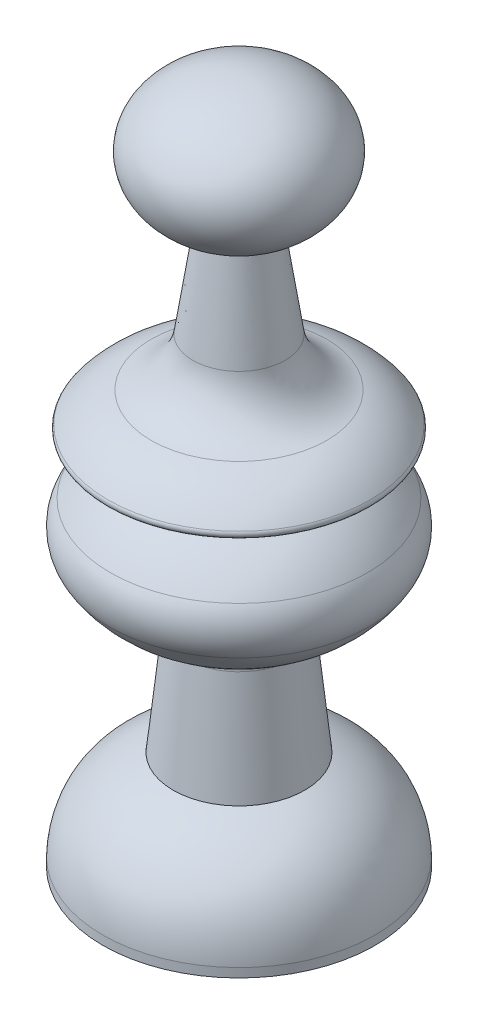
ISO-10303-21;
HEADER;
FILE_DESCRIPTION(('STEP AP214'),'2;1');
FILE_NAME('part.step','',(''),(''),'','','');
FILE_SCHEMA(('AUTOMOTIVE_DESIGN { 1 0 10303 214 1 1 1 1 }'));
ENDSEC;
DATA;
#1=APPLICATION_CONTEXT('core data for automotive mechanical design processes');
#2=APPLICATION_PROTOCOL_DEFINITION('international standard','automotive_design',2000,#1);
#3=PRODUCT_CONTEXT('',#1,'mechanical');
#4=PRODUCT('Part','Part','',(#3));
#5=PRODUCT_RELATED_PRODUCT_CATEGORY('part','',(#4));
#6=PRODUCT_DEFINITION_FORMATION('','',#4);
#7=PRODUCT_DEFINITION_CONTEXT('part definition',#1,'design');
#8=PRODUCT_DEFINITION('design','',#6,#7);
#9=PRODUCT_DEFINITION_SHAPE('','',#8);
#10=(LENGTH_UNIT() NAMED_UNIT(*) SI_UNIT(.MILLI.,.METRE.));
#11=(NAMED_UNIT(*) PLANE_ANGLE_UNIT() SI_UNIT($,.RADIAN.));
#12=(NAMED_UNIT(*) SI_UNIT($,.STERADIAN.) SOLID_ANGLE_UNIT());
#13=UNCERTAINTY_MEASURE_WITH_UNIT(LENGTH_MEASURE(1.E-05),#10,'distance_accuracy_value','');
#14=(GEOMETRIC_REPRESENTATION_CONTEXT(3) GLOBAL_UNCERTAINTY_ASSIGNED_CONTEXT((#13)) GLOBAL_UNIT_ASSIGNED_CONTEXT((#10,
#11,#12)) REPRESENTATION_CONTEXT('',''));
#15=CARTESIAN_POINT('',(0.,0.,0.));
#16=DIRECTION('',(0.,0.,1.));
#17=DIRECTION('',(1.,0.,0.));
#18=AXIS2_PLACEMENT_3D('',#15,#16,#17);
#19=CARTESIAN_POINT('',(0.,-0.762,0.));
#20=DIRECTION('',(0.,1.,0.));
#21=DIRECTION('',(0.,0.,1.));
#22=AXIS2_PLACEMENT_3D('',#19,#20,#21);
#23=CYLINDRICAL_SURFACE('',#22,11.5);
#24=CARTESIAN_POINT('',(0.,-0.762,0.));
#25=DIRECTION('',(0.,-1.,0.));
#26=DIRECTION('',(0.,0.,-1.));
#27=AXIS2_PLACEMENT_3D('',#24,#25,#26);
#28=CIRCLE('',#27,11.5);
#29=CARTESIAN_POINT('',(0.,-0.762,11.5));
#30=VERTEX_POINT('',#29);
#31=EDGE_CURVE('E11',#30,#30,#28,.T.);
#32=CARTESIAN_POINT('',(0.,0.,0.));
#33=DIRECTION('',(0.,-1.,0.));
#34=DIRECTION('',(0.,0.,-1.));
#35=AXIS2_PLACEMENT_3D('',#32,#33,#34);
#36=CIRCLE('',#35,11.5);
#37=CARTESIAN_POINT('',(0.,0.,11.5));
#38=VERTEX_POINT('',#37);
#39=EDGE_CURVE('E45',#38,#38,#36,.T.);
#40=CARTESIAN_POINT('',(0.,-0.762,11.5));
#41=CARTESIAN_POINT('',(0.,-0.7540625,11.5));
#42=CARTESIAN_POINT('',(0.,-0.746125,11.5));
#43=CARTESIAN_POINT('',(0.,-0.73025,11.5));
#44=CARTESIAN_POINT('',(0.,-0.7223125,11.5));
#45=CARTESIAN_POINT('',(0.,-0.7064375,11.5));
#46=CARTESIAN_POINT('',(0.,-0.6985,11.5));
#47=CARTESIAN_POINT('',(0.,-0.682625,11.5));
#48=CARTESIAN_POINT('',(0.,-0.6746875,11.5));
#49=CARTESIAN_POINT('',(0.,-0.6588125,11.5));
#50=CARTESIAN_POINT('',(0.,-0.650875,11.5));
#51=CARTESIAN_POINT('',(0.,-0.635,11.5));
#52=CARTESIAN_POINT('',(0.,-0.6270625,11.5));
#53=CARTESIAN_POINT('',(0.,-0.6111875,11.5));
#54=CARTESIAN_POINT('',(0.,-0.60325,11.5));
#55=CARTESIAN_POINT('',(0.,-0.587375,11.5));
#56=CARTESIAN_POINT('',(0.,-0.5794375,11.5));
#57=CARTESIAN_POINT('',(0.,-0.5635625,11.5));
#58=CARTESIAN_POINT('',(0.,-0.555625,11.5));
#59=CARTESIAN_POINT('',(0.,-0.53975,11.5));
#60=CARTESIAN_POINT('',(0.,-0.5318125,11.5));
#61=CARTESIAN_POINT('',(0.,-0.5159375,11.5));
#62=CARTESIAN_POINT('',(0.,-0.508,11.5));
#63=CARTESIAN_POINT('',(0.,-0.492125,11.5));
#64=CARTESIAN_POINT('',(0.,-0.4841875,11.5));
#65=CARTESIAN_POINT('',(0.,-0.4683125,11.5));
#66=CARTESIAN_POINT('',(0.,-0.460375,11.5));
#67=CARTESIAN_POINT('',(0.,-0.4445,11.5));
#68=CARTESIAN_POINT('',(0.,-0.4365625,11.5));
#69=CARTESIAN_POINT('',(0.,-0.4206875,11.5));
#70=CARTESIAN_POINT('',(0.,-0.41275,11.5));
#71=CARTESIAN_POINT('',(0.,-0.396875,11.5));
#72=CARTESIAN_POINT('',(0.,-0.3889375,11.5));
#73=CARTESIAN_POINT('',(0.,-0.3730625,11.5));
#74=CARTESIAN_POINT('',(0.,-0.365125,11.5));
#75=CARTESIAN_POINT('',(0.,-0.34925,11.5));
#76=CARTESIAN_POINT('',(0.,-0.3413125,11.5));
#77=CARTESIAN_POINT('',(0.,-0.3254375,11.5));
#78=CARTESIAN_POINT('',(0.,-0.3175,11.5));
#79=CARTESIAN_POINT('',(0.,-0.301625,11.5));
#80=CARTESIAN_POINT('',(0.,-0.2936875,11.5));
#81=CARTESIAN_POINT('',(0.,-0.2778125,11.5));
#82=CARTESIAN_POINT('',(0.,-0.269875,11.5));
#83=CARTESIAN_POINT('',(0.,-0.254,11.5));
#84=CARTESIAN_POINT('',(0.,-0.2460625,11.5));
#85=CARTESIAN_POINT('',(0.,-0.2301875,11.5));
#86=CARTESIAN_POINT('',(0.,-0.22225,11.5));
#87=CARTESIAN_POINT('',(0.,-0.206375,11.5));
#88=CARTESIAN_POINT('',(0.,-0.1984375,11.5));
#89=CARTESIAN_POINT('',(0.,-0.1825625,11.5));
#90=CARTESIAN_POINT('',(0.,-0.174625,11.5));
#91=CARTESIAN_POINT('',(0.,-0.15875,11.5));
#92=CARTESIAN_POINT('',(0.,-0.1508125,11.5));
#93=CARTESIAN_POINT('',(0.,-0.1349375,11.5));
#94=CARTESIAN_POINT('',(0.,-0.127,11.5));
#95=CARTESIAN_POINT('',(0.,-0.111125,11.5));
#96=CARTESIAN_POINT('',(0.,-0.1031875,11.5));
#97=CARTESIAN_POINT('',(0.,-0.0873125,11.5));
#98=CARTESIAN_POINT('',(0.,-0.079375,11.5));
#99=CARTESIAN_POINT('',(0.,-0.0635,11.5));
#100=CARTESIAN_POINT('',(0.,-0.0555625,11.5));
#101=CARTESIAN_POINT('',(0.,-0.0396875,11.5));
#102=CARTESIAN_POINT('',(0.,-0.03175,11.5));
#103=CARTESIAN_POINT('',(0.,-0.015875,11.5));
#104=CARTESIAN_POINT('',(0.,-0.00793749999999999,11.5));
#105=CARTESIAN_POINT('',(0.,0.,11.5));
#106=B_SPLINE_CURVE_WITH_KNOTS('',3,(#40,#41,#42,#43,#44,#45,#46,#47,#48,#49,#50,#51,#52,#53,
#54,#55,#56,#57,#58,#59,#60,#61,#62,#63,#64,#65,#66,#67,#68,#69,#70,#71,#72,#73,#74,#75,#76,#77,
#78,#79,#80,#81,#82,#83,#84,#85,#86,#87,#88,#89,#90,#91,#92,#93,#94,#95,#96,#97,#98,#99,#100,
#101,#102,#103,#104,#105),.UNSPECIFIED.,.F.,.F.,(4,2,2,2,2,2,2,2,2,2,2,2,2,2,2,2,2,2,2,2,2,2,2,
2,2,2,2,2,2,2,2,2,4),(0.,0.0238125000000001,0.047625,0.0714375,0.0952500000000001,0.1190625,
0.142875,0.1666875,0.1905,0.2143125,0.238125,0.2619375,0.28575,0.3095625,0.333375,0.3571875,
0.381,0.4048125,0.428625,0.4524375,0.47625,0.5000625,0.523875,0.5476875,0.5715,0.5953125,
0.619125,0.6429375,0.66675,0.6905625,0.714375,0.7381875,0.762),.UNSPECIFIED.);
#107=EDGE_CURVE('BSEAM42',#30,#38,#106,.T.);
#108=ORIENTED_EDGE('',*,*,#31,.F.);
#109=ORIENTED_EDGE('',*,*,#39,.T.);
#110=ORIENTED_EDGE('',*,*,#107,.T.);
#111=ORIENTED_EDGE('',*,*,#107,.F.);
#112=EDGE_LOOP('',(#108,#110,#109,#111));
#113=FACE_BOUND('',#112,.T.);
#114=ADVANCED_FACE('F42',(#113),#23,.T.);
#115=CARTESIAN_POINT('',(0.,-0.762,0.));
#116=DIRECTION('',(0.,-1.,0.));
#117=DIRECTION('',(0.,0.,-1.));
#118=AXIS2_PLACEMENT_3D('',#115,#116,#117);
#119=PLANE('',#118);
#120=ORIENTED_EDGE('',*,*,#31,.T.);
#121=EDGE_LOOP('',(#120));
#122=FACE_BOUND('',#121,.T.);
#123=ADVANCED_FACE('F57',(#122),#119,.T.);
#124=CARTESIAN_POINT('',(0.,0.,0.));
#125=DIRECTION('',(0.,-1.,0.));
#126=DIRECTION('',(0.,0.,-1.));
#127=AXIS2_PLACEMENT_3D('',#124,#125,#126);
#128=PLANE('',#127);
#129=ORIENTED_EDGE('',*,*,#39,.F.);
#130=EDGE_LOOP('',(#129));
#131=FACE_BOUND('',#130,.T.);
#132=ADVANCED_FACE('F55',(#131),#128,.F.);
#133=CLOSED_SHELL('',(#114,#123,#132));
#134=MANIFOLD_SOLID_BREP('B2',#133);
#135=CARTESIAN_POINT('',(0.,51.5874,0.));
#136=DIRECTION('',(0.,0.,1.));
#137=DIRECTION('',(-1.,0.,0.));
#138=AXIS2_PLACEMENT_3D('',#135,#136,#137);
#139=ELLIPSE('',#138,7.5,5.5626);
#140=TRIMMED_CURVE('',#139,(PARAMETER_VALUE(4.71238898038469)),
(PARAMETER_VALUE(7.85398163397448)),.T.,.PARAMETER.);
#141=CARTESIAN_POINT('',(0.,57.15,0.));
#142=DIRECTION('',(0.,1.,0.));
#143=AXIS1_PLACEMENT('',#141,#142);
#144=SURFACE_OF_REVOLUTION('',#140,#143);
#145=CARTESIAN_POINT('',(0.,46.3883813251949,0.));
#146=DIRECTION('',(0.,1.,0.));
#147=DIRECTION('',(0.,0.,1.));
#148=AXIS2_PLACEMENT_3D('',#145,#146,#147);
#149=CIRCLE('',#148,2.667);
#150=CARTESIAN_POINT('',(0.,46.3883813251949,2.667));
#151=VERTEX_POINT('',#150);
#152=EDGE_CURVE('E183',#151,#151,#149,.T.);
#153=ORIENTED_EDGE('',*,*,#152,.T.);
#154=EDGE_LOOP('',(#153));
#155=FACE_BOUND('',#154,.T.);
#156=CARTESIAN_POINT('',(0.,57.15,0.));
#157=VERTEX_POINT('',#156);
#158=VERTEX_LOOP('',#157);
#159=FACE_BOUND('',#158,.T.);
#160=ADVANCED_FACE('F82',(#155,#159),#144,.F.);
#161=CARTESIAN_POINT('',(0.,46.3883813251949,0.));
#162=DIRECTION('',(0.,-1.,0.));
#163=DIRECTION('',(0.,0.,-1.));
#164=AXIS2_PLACEMENT_3D('',#161,#162,#163);
#165=CONICAL_SURFACE('',#164,2.667,0.148936487119344);
#166=CARTESIAN_POINT('',(0.,38.2255562459417,0.));
#167=DIRECTION('',(0.,-1.,0.));
#168=DIRECTION('',(0.,0.,-1.));
#169=AXIS2_PLACEMENT_3D('',#166,#167,#168);
#170=CIRCLE('',#169,3.89181220609037);
#171=CARTESIAN_POINT('',(0.,38.2255562459417,-3.89181220609037));
#172=VERTEX_POINT('',#171);
#173=EDGE_CURVE('E89',#172,#172,#170,.F.);
#174=ORIENTED_EDGE('',*,*,#173,.T.);
#175=EDGE_LOOP('',(#174));
#176=FACE_BOUND('',#175,.T.);
#177=ORIENTED_EDGE('',*,*,#152,.F.);
#178=EDGE_LOOP('',(#177));
#179=FACE_BOUND('',#178,.T.);
#180=ADVANCED_FACE('F93',(#176,#179),#165,.T.);
#181=CARTESIAN_POINT('',(-4.445,34.5388072282485,0.));
#182=CARTESIAN_POINT('',(-9.19816109145442,34.5482993297111,0.));
#183=CARTESIAN_POINT('',(-11.5,30.988,0.));
#184=B_SPLINE_CURVE_WITH_KNOTS('',2,(#181,#182,#183),.UNSPECIFIED.,.F.,.F.,(3,3),(0.,1.),.UNSPECIFIED.);
#185=CARTESIAN_POINT('',(0.,57.15,0.));
#186=DIRECTION('',(0.,1.,0.));
#187=AXIS1_PLACEMENT('',#185,#186);
#188=SURFACE_OF_REVOLUTION('',#184,#187);
#189=CARTESIAN_POINT('',(0.,34.1269149765701,0.));
#190=DIRECTION('',(0.,1.,0.));
#191=DIRECTION('',(0.,0.,1.));
#192=AXIS2_PLACEMENT_3D('',#189,#190,#191);
#193=CIRCLE('',#192,7.41218374940522);
#194=CARTESIAN_POINT('',(0.,34.1269149765701,7.41218374940522));
#195=VERTEX_POINT('',#194);
#196=EDGE_CURVE('E40',#195,#195,#193,.F.);
#197=ORIENTED_EDGE('',*,*,#196,.T.);
#198=EDGE_LOOP('',(#197));
#199=FACE_BOUND('',#198,.T.);
#200=CARTESIAN_POINT('',(0.,31.603252244644,0.));
#201=DIRECTION('',(0.,1.,0.));
#202=DIRECTION('',(0.,0.,1.));
#203=AXIS2_PLACEMENT_3D('',#200,#201,#202);
#204=CIRCLE('',#203,11.063231317849);
#205=CARTESIAN_POINT('',(0.,31.603252244644,11.063231317849));
#206=VERTEX_POINT('',#205);
#207=EDGE_CURVE('E185',#206,#206,#204,.T.);
#208=ORIENTED_EDGE('',*,*,#207,.T.);
#209=EDGE_LOOP('',(#208));
#210=FACE_BOUND('',#209,.T.);
#211=ADVANCED_FACE('F99',(#199,#210),#188,.F.);
#212=CARTESIAN_POINT('',(-4.4595788736174,30.988,0.));
#213=DIRECTION('',(0.,-1.,0.));
#214=DIRECTION('',(0.,0.,-1.));
#215=AXIS2_PLACEMENT_3D('',#212,#213,#214);
#216=PLANE('',#215);
#217=CARTESIAN_POINT('',(0.,30.988,0.));
#218=DIRECTION('',(0.,-1.,0.));
#219=DIRECTION('',(0.,0.,-1.));
#220=AXIS2_PLACEMENT_3D('',#217,#218,#219);
#221=CIRCLE('',#220,10.7627535551456);
#222=CARTESIAN_POINT('',(0.,30.988,-10.7627535551456));
#223=VERTEX_POINT('',#222);
#224=EDGE_CURVE('E191',#223,#223,#221,.T.);
#225=ORIENTED_EDGE('',*,*,#224,.T.);
#226=EDGE_LOOP('',(#225));
#227=FACE_BOUND('',#226,.T.);
#228=CARTESIAN_POINT('',(0.,30.988,0.));
#229=DIRECTION('',(0.,-1.,0.));
#230=DIRECTION('',(0.,0.,-1.));
#231=AXIS2_PLACEMENT_3D('',#228,#229,#230);
#232=CIRCLE('',#231,4.8405788736174);
#233=CARTESIAN_POINT('',(0.,30.988,-4.8405788736174));
#234=VERTEX_POINT('',#233);
#235=EDGE_CURVE('E188',#234,#234,#232,.F.);
#236=ORIENTED_EDGE('',*,*,#235,.T.);
#237=EDGE_LOOP('',(#236));
#238=FACE_BOUND('',#237,.T.);
#239=ADVANCED_FACE('F123',(#227,#238),#216,.T.);
#240=CARTESIAN_POINT('',(0.,57.15,0.));
#241=DIRECTION('',(0.,1.,0.));
#242=DIRECTION('',(0.,0.,1.));
#243=AXIS2_PLACEMENT_3D('',#240,#241,#242);
#244=CYLINDRICAL_SURFACE('',#243,4.4595788736174);
#245=CARTESIAN_POINT('',(0.,30.607,0.));
#246=DIRECTION('',(0.,-1.,0.));
#247=DIRECTION('',(0.,0.,-1.));
#248=AXIS2_PLACEMENT_3D('',#245,#246,#247);
#249=CIRCLE('',#248,4.4595788736174);
#250=CARTESIAN_POINT('',(0.,30.607,-4.4595788736174));
#251=VERTEX_POINT('',#250);
#252=EDGE_CURVE('E197',#251,#251,#249,.T.);
#253=ORIENTED_EDGE('',*,*,#252,.T.);
#254=EDGE_LOOP('',(#253));
#255=FACE_BOUND('',#254,.T.);
#256=CARTESIAN_POINT('',(0.,30.4148833070592,0.));
#257=DIRECTION('',(0.,1.,0.));
#258=DIRECTION('',(0.,0.,1.));
#259=AXIS2_PLACEMENT_3D('',#256,#257,#258);
#260=CIRCLE('',#259,4.4595788736174);
#261=CARTESIAN_POINT('',(0.,30.4148833070592,4.4595788736174));
#262=VERTEX_POINT('',#261);
#263=EDGE_CURVE('E194',#262,#262,#260,.T.);
#264=ORIENTED_EDGE('',*,*,#263,.T.);
#265=EDGE_LOOP('',(#264));
#266=FACE_BOUND('',#265,.T.);
#267=ADVANCED_FACE('F127',(#255,#266),#244,.T.);
#268=CARTESIAN_POINT('',(0.,20.9247113657962,0.));
#269=DIRECTION('',(0.,1.,0.));
#270=DIRECTION('',(0.,0.,1.));
#271=AXIS2_PLACEMENT_3D('',#268,#269,#270);
#272=DEGENERATE_TOROIDAL_SURFACE('',#271,3.27286355674606,9.23778863420382,.T.);
#273=CARTESIAN_POINT('',(0.,30.0389778113543,0.));
#274=DIRECTION('',(0.,-1.,0.));
#275=DIRECTION('',(0.,0.,-1.));
#276=AXIS2_PLACEMENT_3D('',#273,#274,#275);
#277=CIRCLE('',#276,4.77848170541433);
#278=CARTESIAN_POINT('',(0.,30.0389778113543,-4.77848170541433));
#279=VERTEX_POINT('',#278);
#280=EDGE_CURVE('E200',#279,#279,#277,.T.);
#281=ORIENTED_EDGE('',*,*,#280,.T.);
#282=EDGE_LOOP('',(#281));
#283=FACE_BOUND('',#282,.T.);
#284=CARTESIAN_POINT('',(0.,26.1838587753556,0.));
#285=DIRECTION('',(0.,1.,0.));
#286=DIRECTION('',(0.,0.,1.));
#287=AXIS2_PLACEMENT_3D('',#284,#285,#286);
#288=CIRCLE('',#287,10.8674739730051);
#289=CARTESIAN_POINT('',(0.,26.1838587753556,10.8674739730051));
#290=VERTEX_POINT('',#289);
#291=EDGE_CURVE('E180',#290,#290,#288,.T.);
#292=ORIENTED_EDGE('',*,*,#291,.T.);
#293=EDGE_LOOP('',(#292));
#294=FACE_BOUND('',#293,.T.);
#295=ADVANCED_FACE('F131',(#283,#294),#272,.T.);
#296=CARTESIAN_POINT('',(0.,24.1593993588293,0.));
#297=DIRECTION('',(0.,1.,0.));
#298=DIRECTION('',(0.,0.,1.));
#299=AXIS2_PLACEMENT_3D('',#296,#297,#298);
#300=TOROIDAL_SURFACE('',#299,7.944,3.556);
#301=CARTESIAN_POINT('',(0.,22.2413344909624,0.));
#302=DIRECTION('',(0.,1.,0.));
#303=DIRECTION('',(0.,0.,1.));
#304=AXIS2_PLACEMENT_3D('',#301,#302,#303);
#305=CIRCLE('',#304,10.9383552165124);
#306=CARTESIAN_POINT('',(0.,22.2413344909624,10.9383552165124));
#307=VERTEX_POINT('',#306);
#308=EDGE_CURVE('E177',#307,#307,#305,.T.);
#309=ORIENTED_EDGE('',*,*,#308,.T.);
#310=EDGE_LOOP('',(#309));
#311=FACE_BOUND('',#310,.T.);
#312=ORIENTED_EDGE('',*,*,#291,.F.);
#313=EDGE_LOOP('',(#312));
#314=FACE_BOUND('',#313,.T.);
#315=ADVANCED_FACE('F135',(#311,#314),#300,.T.);
#316=CARTESIAN_POINT('',(0.,27.151543595896,0.));
#317=DIRECTION('',(0.,1.,0.));
#318=DIRECTION('',(0.,0.,1.));
#319=AXIS2_PLACEMENT_3D('',#316,#317,#318);
#320=DEGENERATE_TOROIDAL_SURFACE('',#319,3.27286355674606,9.10329148386005,.T.);
#321=CARTESIAN_POINT('',(0.,18.3811568773071,0.));
#322=DIRECTION('',(0.,1.,0.));
#323=DIRECTION('',(0.,0.,1.));
#324=AXIS2_PLACEMENT_3D('',#321,#322,#323);
#325=CIRCLE('',#324,5.71217342769698);
#326=CARTESIAN_POINT('',(0.,18.3811568773071,5.71217342769698));
#327=VERTEX_POINT('',#326);
#328=EDGE_CURVE('E174',#327,#327,#325,.T.);
#329=ORIENTED_EDGE('',*,*,#328,.T.);
#330=EDGE_LOOP('',(#329));
#331=FACE_BOUND('',#330,.T.);
#332=ORIENTED_EDGE('',*,*,#308,.F.);
#333=EDGE_LOOP('',(#332));
#334=FACE_BOUND('',#333,.T.);
#335=ADVANCED_FACE('F139',(#331,#334),#320,.T.);
#336=CARTESIAN_POINT('',(0.,16.9128891213171,0.));
#337=DIRECTION('',(0.,1.,0.));
#338=DIRECTION('',(0.,0.,1.));
#339=AXIS2_PLACEMENT_3D('',#336,#337,#338);
#340=TOROIDAL_SURFACE('',#339,6.12054310913806,1.524);
#341=CARTESIAN_POINT('',(0.,16.7550493432857,0.));
#342=DIRECTION('',(0.,1.,0.));
#343=DIRECTION('',(0.,0.,1.));
#344=AXIS2_PLACEMENT_3D('',#341,#342,#343);
#345=CIRCLE('',#344,4.60473883269898);
#346=CARTESIAN_POINT('',(0.,16.7550493432857,4.60473883269898));
#347=VERTEX_POINT('',#346);
#348=EDGE_CURVE('E169',#347,#347,#345,.T.);
#349=ORIENTED_EDGE('',*,*,#348,.T.);
#350=EDGE_LOOP('',(#349));
#351=FACE_BOUND('',#350,.T.);
#352=ORIENTED_EDGE('',*,*,#328,.F.);
#353=EDGE_LOOP('',(#352));
#354=FACE_BOUND('',#353,.T.);
#355=ADVANCED_FACE('F143',(#351,#354),#340,.F.);
#356=CARTESIAN_POINT('',(0.,16.7550493432857,0.));
#357=DIRECTION('',(0.,-1.,0.));
#358=DIRECTION('',(0.,0.,-1.));
#359=AXIS2_PLACEMENT_3D('',#356,#357,#358);
#360=CONICAL_SURFACE('',#359,4.60473883269898,0.103755465981784);
#361=CARTESIAN_POINT('',(0.,7.61727232368625,0.));
#362=DIRECTION('',(0.,1.,0.));
#363=DIRECTION('',(0.,0.,1.));
#364=AXIS2_PLACEMENT_3D('',#361,#362,#363);
#365=CIRCLE('',#364,5.55625);
#366=CARTESIAN_POINT('',(0.,7.61727232368625,5.55625));
#367=VERTEX_POINT('',#366);
#368=EDGE_CURVE('E167',#367,#367,#365,.T.);
#369=ORIENTED_EDGE('',*,*,#368,.T.);
#370=EDGE_LOOP('',(#369));
#371=FACE_BOUND('',#370,.T.);
#372=ORIENTED_EDGE('',*,*,#348,.F.);
#373=EDGE_LOOP('',(#372));
#374=FACE_BOUND('',#373,.T.);
#375=ADVANCED_FACE('F147',(#371,#374),#360,.T.);
#376=CARTESIAN_POINT('',(-5.55625,7.61727232368625,0.));
#377=CARTESIAN_POINT('',(-11.2207392934526,5.54480325649878,0.));
#378=CARTESIAN_POINT('',(-11.5,0.,0.));
#379=B_SPLINE_CURVE_WITH_KNOTS('',2,(#376,#377,#378),.UNSPECIFIED.,.F.,.F.,(3,3),(0.,1.),.UNSPECIFIED.);
#380=CARTESIAN_POINT('',(0.,57.15,0.));
#381=DIRECTION('',(0.,1.,0.));
#382=AXIS1_PLACEMENT('',#380,#381);
#383=SURFACE_OF_REVOLUTION('',#379,#382);
#384=CARTESIAN_POINT('',(0.,0.,0.));
#385=DIRECTION('',(0.,1.,0.));
#386=DIRECTION('',(0.,0.,1.));
#387=AXIS2_PLACEMENT_3D('',#384,#385,#386);
#388=CIRCLE('',#387,11.5);
#389=CARTESIAN_POINT('',(0.,0.,11.5));
#390=VERTEX_POINT('',#389);
#391=EDGE_CURVE('E166',#390,#390,#388,.T.);
#392=ORIENTED_EDGE('',*,*,#391,.T.);
#393=EDGE_LOOP('',(#392));
#394=FACE_BOUND('',#393,.T.);
#395=ORIENTED_EDGE('',*,*,#368,.F.);
#396=EDGE_LOOP('',(#395));
#397=FACE_BOUND('',#396,.T.);
#398=ADVANCED_FACE('F151',(#394,#397),#383,.F.);
#399=CARTESIAN_POINT('',(0.,0.,0.));
#400=DIRECTION('',(0.,-1.,0.));
#401=DIRECTION('',(0.,0.,-1.));
#402=AXIS2_PLACEMENT_3D('',#399,#400,#401);
#403=PLANE('',#402);
#404=ORIENTED_EDGE('',*,*,#391,.F.);
#405=EDGE_LOOP('',(#404));
#406=FACE_BOUND('',#405,.T.);
#407=ADVANCED_FACE('F155',(#406),#403,.T.);
#408=CARTESIAN_POINT('',(0.,31.369,0.));
#409=DIRECTION('',(0.,1.,0.));
#410=DIRECTION('',(0.,0.,1.));
#411=AXIS2_PLACEMENT_3D('',#408,#409,#410);
#412=TOROIDAL_SURFACE('',#411,10.7627535551456,0.381);
#413=ORIENTED_EDGE('',*,*,#224,.F.);
#414=EDGE_LOOP('',(#413));
#415=FACE_BOUND('',#414,.T.);
#416=ORIENTED_EDGE('',*,*,#207,.F.);
#417=EDGE_LOOP('',(#416));
#418=FACE_BOUND('',#417,.T.);
#419=ADVANCED_FACE('F106',(#415,#418),#412,.T.);
#420=CARTESIAN_POINT('',(0.,30.607,0.));
#421=DIRECTION('',(0.,-1.,0.));
#422=DIRECTION('',(0.,0.,-1.));
#423=AXIS2_PLACEMENT_3D('',#420,#421,#422);
#424=TOROIDAL_SURFACE('',#423,4.8405788736174,0.381);
#425=ORIENTED_EDGE('',*,*,#252,.F.);
#426=EDGE_LOOP('',(#425));
#427=FACE_BOUND('',#426,.T.);
#428=ORIENTED_EDGE('',*,*,#235,.F.);
#429=EDGE_LOOP('',(#428));
#430=FACE_BOUND('',#429,.T.);
#431=ADVANCED_FACE('F162',(#427,#430),#424,.F.);
#432=CARTESIAN_POINT('',(0.,30.4148833070592,0.));
#433=DIRECTION('',(0.,1.,0.));
#434=DIRECTION('',(0.,0.,1.));
#435=AXIS2_PLACEMENT_3D('',#432,#433,#434);
#436=TOROIDAL_SURFACE('',#435,4.8405788736174,0.381);
#437=ORIENTED_EDGE('',*,*,#280,.F.);
#438=EDGE_LOOP('',(#437));
#439=FACE_BOUND('',#438,.T.);
#440=ORIENTED_EDGE('',*,*,#263,.F.);
#441=EDGE_LOOP('',(#440));
#442=FACE_BOUND('',#441,.T.);
#443=ADVANCED_FACE('F207',(#439,#442),#436,.F.);
#444=CARTESIAN_POINT('',(0.,38.9793595510459,0.));
#445=DIRECTION('',(0.,1.,0.));
#446=DIRECTION('',(0.,0.,1.));
#447=AXIS2_PLACEMENT_3D('',#444,#445,#446);
#448=TOROIDAL_SURFACE('',#447,8.91557380246554,5.08);
#449=ORIENTED_EDGE('',*,*,#196,.F.);
#450=EDGE_LOOP('',(#449));
#451=FACE_BOUND('',#450,.T.);
#452=ORIENTED_EDGE('',*,*,#173,.F.);
#453=EDGE_LOOP('',(#452));
#454=FACE_BOUND('',#453,.T.);
#455=ADVANCED_FACE('F84',(#451,#454),#448,.F.);
#456=CLOSED_SHELL('',(#160,#180,#211,#239,#267,#295,#315,#335,#355,#375,#398,#407,#419,#431,
#443,#455));
#457=MANIFOLD_SOLID_BREP('B6',#456);
#458=ADVANCED_BREP_SHAPE_REPRESENTATION('',(#18,#134,#457),#14);
#459=SHAPE_DEFINITION_REPRESENTATION(#9,#458);
ENDSEC;
END-ISO-10303-21;
